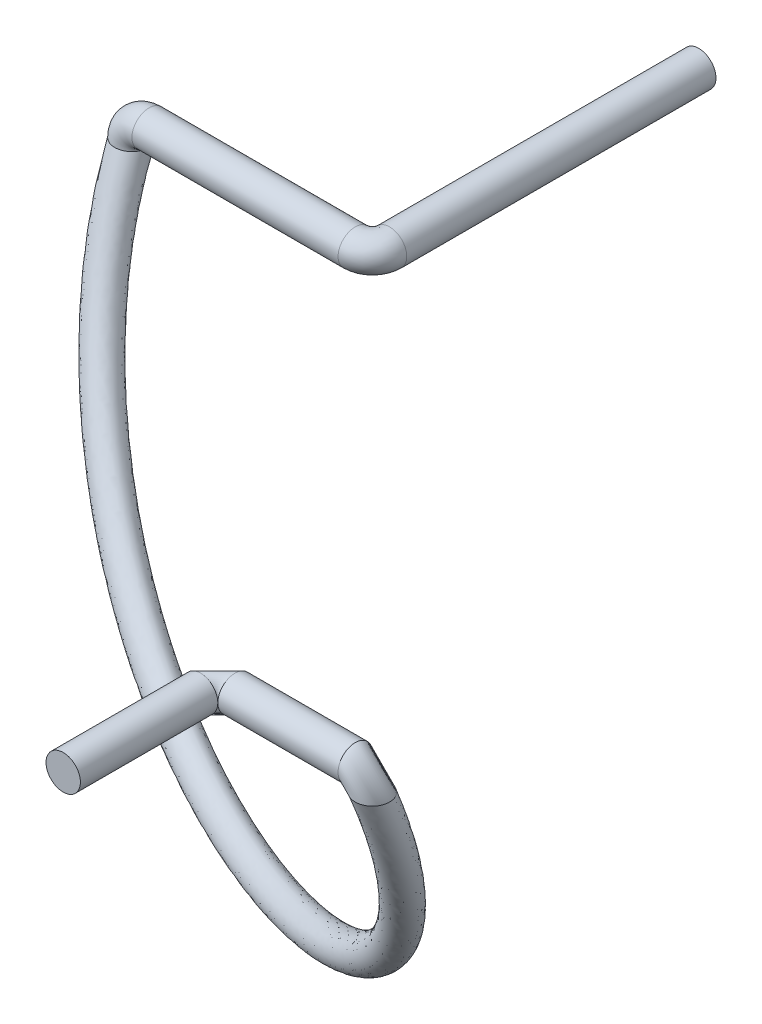
ISO-10303-21;
HEADER;
FILE_DESCRIPTION(('STEP AP214'),'2;1');
FILE_NAME('part.step','',(''),(''),'','','');
FILE_SCHEMA(('AUTOMOTIVE_DESIGN { 1 0 10303 214 1 1 1 1 }'));
ENDSEC;
DATA;
#1=APPLICATION_CONTEXT('core data for automotive mechanical design processes');
#2=APPLICATION_PROTOCOL_DEFINITION('international standard','automotive_design',2000,#1);
#3=PRODUCT_CONTEXT('',#1,'mechanical');
#4=PRODUCT('Part','Part','',(#3));
#5=PRODUCT_RELATED_PRODUCT_CATEGORY('part','',(#4));
#6=PRODUCT_DEFINITION_FORMATION('','',#4);
#7=PRODUCT_DEFINITION_CONTEXT('part definition',#1,'design');
#8=PRODUCT_DEFINITION('design','',#6,#7);
#9=PRODUCT_DEFINITION_SHAPE('','',#8);
#10=(LENGTH_UNIT() NAMED_UNIT(*) SI_UNIT(.MILLI.,.METRE.));
#11=(NAMED_UNIT(*) PLANE_ANGLE_UNIT() SI_UNIT($,.RADIAN.));
#12=(NAMED_UNIT(*) SI_UNIT($,.STERADIAN.) SOLID_ANGLE_UNIT());
#13=UNCERTAINTY_MEASURE_WITH_UNIT(LENGTH_MEASURE(1.E-05),#10,'distance_accuracy_value','');
#14=(GEOMETRIC_REPRESENTATION_CONTEXT(3) GLOBAL_UNCERTAINTY_ASSIGNED_CONTEXT((#13)) GLOBAL_UNIT_ASSIGNED_CONTEXT((#10,
#11,#12)) REPRESENTATION_CONTEXT('',''));
#15=CARTESIAN_POINT('',(0.,0.,0.));
#16=DIRECTION('',(0.,0.,1.));
#17=DIRECTION('',(1.,0.,0.));
#18=AXIS2_PLACEMENT_3D('',#15,#16,#17);
#19=CARTESIAN_POINT('',(-10.,0.,-12.5));
#20=CARTESIAN_POINT('',(-10.,-1.43778293994966,-11.9090909090909));
#21=CARTESIAN_POINT('',(-9.59492973614499,-2.81732556841423,-11.3181818181818));
#22=CARTESIAN_POINT('',(-9.18985947228998,-4.1968681968788,-10.7272727272727));
#23=CARTESIAN_POINT('',(-8.41253532831185,-5.40640817455592,-10.1363636363636));
#24=CARTESIAN_POINT('',(-7.63521118433372,-6.61594815223304,-9.54545454545454));
#25=CARTESIAN_POINT('',(-6.5486073394529,-7.55749574354254,-8.95454545454546));
#26=CARTESIAN_POINT('',(-5.46200349457209,-8.49904333485204,-8.36363636363636));
#27=CARTESIAN_POINT('',(-4.15415013001893,-9.09631995354516,-7.77272727272727));
#28=CARTESIAN_POINT('',(-2.84629676546577,-9.69359657223827,-7.18181818181818));
#29=CARTESIAN_POINT('',(-1.42314838273292,-9.89821441880932,-6.59090909090909));
#30=CARTESIAN_POINT('',(0.,-10.1028322653804,-6.));
#31=CARTESIAN_POINT('',(1.42314838273278,-9.89821441880934,-5.40909090909091));
#32=CARTESIAN_POINT('',(2.84629676546564,-9.69359657223831,-4.81818181818182));
#33=CARTESIAN_POINT('',(4.1541501300188,-9.09631995354521,-4.22727272727273));
#34=CARTESIAN_POINT('',(5.46200349457197,-8.49904333485211,-3.63636363636364));
#35=CARTESIAN_POINT('',(6.5486073394528,-7.55749574354263,-3.04545454545455));
#36=CARTESIAN_POINT('',(7.63521118433363,-6.61594815223315,-2.45454545454545));
#37=CARTESIAN_POINT('',(8.41253532831177,-5.40640817455604,-1.86363636363636));
#38=CARTESIAN_POINT('',(9.18985947228992,-4.19686819687892,-1.27272727272727));
#39=CARTESIAN_POINT('',(9.59492973614495,-2.81732556841436,-0.681818181818183));
#40=CARTESIAN_POINT('',(9.99999999999999,-1.4377829399498,-0.0909090909090911));
#41=CARTESIAN_POINT('',(10.,0.,0.499999999999999));
#42=CARTESIAN_POINT('',(-11.,0.,-12.5));
#43=CARTESIAN_POINT('',(-11.,-1.58156123394463,-11.9090909090909));
#44=CARTESIAN_POINT('',(-10.5544227097595,-3.09905812525565,-11.3181818181818));
#45=CARTESIAN_POINT('',(-10.108845419519,-4.61655501656668,-10.7272727272727));
#46=CARTESIAN_POINT('',(-9.25378886114304,-5.94704899201151,-10.1363636363636));
#47=CARTESIAN_POINT('',(-8.3987323027671,-7.27754296745634,-9.54545454545454));
#48=CARTESIAN_POINT('',(-7.2034680733982,-8.31324531789679,-8.95454545454546));
#49=CARTESIAN_POINT('',(-6.00820384402929,-9.34894766833724,-8.36363636363636));
#50=CARTESIAN_POINT('',(-4.56956514302082,-10.0059519488997,-7.77272727272727));
#51=CARTESIAN_POINT('',(-3.13092644201235,-10.6629562294621,-7.18181818181818));
#52=CARTESIAN_POINT('',(-1.56546322100621,-10.8880358606903,-6.59090909090909));
#53=CARTESIAN_POINT('',(0.,-11.1131154919184,-6.));
#54=CARTESIAN_POINT('',(1.56546322100606,-10.8880358606903,-5.40909090909091));
#55=CARTESIAN_POINT('',(3.1309264420122,-10.6629562294621,-4.81818181818182));
#56=CARTESIAN_POINT('',(4.56956514302068,-10.0059519488997,-4.22727272727273));
#57=CARTESIAN_POINT('',(6.00820384402916,-9.34894766833732,-3.63636363636364));
#58=CARTESIAN_POINT('',(7.20346807339808,-8.31324531789689,-3.04545454545455));
#59=CARTESIAN_POINT('',(8.39873230276699,-7.27754296745646,-2.45454545454545));
#60=CARTESIAN_POINT('',(9.25378886114295,-5.94704899201164,-1.86363636363636));
#61=CARTESIAN_POINT('',(10.1088454195189,-4.61655501656682,-1.27272727272727));
#62=CARTESIAN_POINT('',(10.5544227097595,-3.0990581252558,-0.681818181818183));
#63=CARTESIAN_POINT('',(11.,-1.58156123394478,-0.0909090909090911));
#64=CARTESIAN_POINT('',(11.,0.,0.499999999999999));
#65=CARTESIAN_POINT('',(-11.,0.,-13.5));
#66=CARTESIAN_POINT('',(-11.,-1.58156123394463,-12.9090909090909));
#67=CARTESIAN_POINT('',(-10.5544227097595,-3.09905812525565,-12.3181818181818));
#68=CARTESIAN_POINT('',(-10.108845419519,-4.61655501656668,-11.7272727272727));
#69=CARTESIAN_POINT('',(-9.25378886114304,-5.94704899201151,-11.1363636363636));
#70=CARTESIAN_POINT('',(-8.3987323027671,-7.27754296745634,-10.5454545454545));
#71=CARTESIAN_POINT('',(-7.2034680733982,-8.31324531789679,-9.95454545454546));
#72=CARTESIAN_POINT('',(-6.00820384402929,-9.34894766833724,-9.36363636363636));
#73=CARTESIAN_POINT('',(-4.56956514302082,-10.0059519488997,-8.77272727272727));
#74=CARTESIAN_POINT('',(-3.13092644201235,-10.6629562294621,-8.18181818181818));
#75=CARTESIAN_POINT('',(-1.56546322100621,-10.8880358606903,-7.59090909090909));
#76=CARTESIAN_POINT('',(0.,-11.1131154919184,-7.));
#77=CARTESIAN_POINT('',(1.56546322100606,-10.8880358606903,-6.40909090909091));
#78=CARTESIAN_POINT('',(3.1309264420122,-10.6629562294621,-5.81818181818182));
#79=CARTESIAN_POINT('',(4.56956514302068,-10.0059519488997,-5.22727272727273));
#80=CARTESIAN_POINT('',(6.00820384402916,-9.34894766833732,-4.63636363636364));
#81=CARTESIAN_POINT('',(7.20346807339808,-8.31324531789689,-4.04545454545455));
#82=CARTESIAN_POINT('',(8.39873230276699,-7.27754296745646,-3.45454545454546));
#83=CARTESIAN_POINT('',(9.25378886114295,-5.94704899201164,-2.86363636363637));
#84=CARTESIAN_POINT('',(10.1088454195189,-4.61655501656682,-2.27272727272727));
#85=CARTESIAN_POINT('',(10.5544227097595,-3.0990581252558,-1.68181818181818));
#86=CARTESIAN_POINT('',(11.,-1.58156123394478,-1.09090909090909));
#87=CARTESIAN_POINT('',(11.,0.,-0.500000000000002));
#88=CARTESIAN_POINT('',(-10.,0.,-13.5));
#89=CARTESIAN_POINT('',(-10.,-1.43778293994966,-12.9090909090909));
#90=CARTESIAN_POINT('',(-9.59492973614499,-2.81732556841423,-12.3181818181818));
#91=CARTESIAN_POINT('',(-9.18985947228998,-4.1968681968788,-11.7272727272727));
#92=CARTESIAN_POINT('',(-8.41253532831185,-5.40640817455592,-11.1363636363636));
#93=CARTESIAN_POINT('',(-7.63521118433372,-6.61594815223304,-10.5454545454545));
#94=CARTESIAN_POINT('',(-6.5486073394529,-7.55749574354254,-9.95454545454546));
#95=CARTESIAN_POINT('',(-5.46200349457209,-8.49904333485204,-9.36363636363636));
#96=CARTESIAN_POINT('',(-4.15415013001893,-9.09631995354516,-8.77272727272727));
#97=CARTESIAN_POINT('',(-2.84629676546577,-9.69359657223827,-8.18181818181818));
#98=CARTESIAN_POINT('',(-1.42314838273292,-9.89821441880932,-7.59090909090909));
#99=CARTESIAN_POINT('',(0.,-10.1028322653804,-7.));
#100=CARTESIAN_POINT('',(1.42314838273278,-9.89821441880934,-6.40909090909091));
#101=CARTESIAN_POINT('',(2.84629676546564,-9.69359657223831,-5.81818181818182));
#102=CARTESIAN_POINT('',(4.1541501300188,-9.09631995354521,-5.22727272727273));
#103=CARTESIAN_POINT('',(5.46200349457197,-8.49904333485211,-4.63636363636364));
#104=CARTESIAN_POINT('',(6.5486073394528,-7.55749574354263,-4.04545454545455));
#105=CARTESIAN_POINT('',(7.63521118433363,-6.61594815223315,-3.45454545454546));
#106=CARTESIAN_POINT('',(8.41253532831177,-5.40640817455604,-2.86363636363637));
#107=CARTESIAN_POINT('',(9.18985947228992,-4.19686819687892,-2.27272727272727));
#108=CARTESIAN_POINT('',(9.59492973614495,-2.81732556841436,-1.68181818181818));
#109=CARTESIAN_POINT('',(9.99999999999999,-1.4377829399498,-1.09090909090909));
#110=CARTESIAN_POINT('',(10.,0.,-0.500000000000002));
#111=CARTESIAN_POINT('',(-9.,0.,-13.5));
#112=CARTESIAN_POINT('',(-9.00000000000001,-1.2940046459547,-12.9090909090909));
#113=CARTESIAN_POINT('',(-8.63543676253049,-2.53559301157281,-12.3181818181818));
#114=CARTESIAN_POINT('',(-8.27087352506098,-3.77718137719092,-11.7272727272727));
#115=CARTESIAN_POINT('',(-7.57128179548066,-4.86576735710033,-11.1363636363636));
#116=CARTESIAN_POINT('',(-6.87169006590035,-5.95435333700974,-10.5454545454545));
#117=CARTESIAN_POINT('',(-5.89374660550761,-6.80174616918828,-9.95454545454546));
#118=CARTESIAN_POINT('',(-4.91580314511488,-7.64913900136683,-9.36363636363636));
#119=CARTESIAN_POINT('',(-3.73873511701703,-8.18668795819064,-8.77272727272727));
#120=CARTESIAN_POINT('',(-2.56166708891919,-8.72423691501444,-8.18181818181818));
#121=CARTESIAN_POINT('',(-1.28083354445963,-8.90839297692838,-7.59090909090909));
#122=CARTESIAN_POINT('',(0.,-9.09254903884232,-7.));
#123=CARTESIAN_POINT('',(1.2808335444595,-8.9083929769284,-6.40909090909091));
#124=CARTESIAN_POINT('',(2.56166708891907,-8.72423691501448,-5.81818181818182));
#125=CARTESIAN_POINT('',(3.73873511701692,-8.18668795819069,-5.22727272727273));
#126=CARTESIAN_POINT('',(4.91580314511477,-7.6491390013669,-4.63636363636364));
#127=CARTESIAN_POINT('',(5.89374660550752,-6.80174616918836,-4.04545454545455));
#128=CARTESIAN_POINT('',(6.87169006590026,-5.95435333700983,-3.45454545454546));
#129=CARTESIAN_POINT('',(7.5712817954806,-4.86576735710043,-2.86363636363637));
#130=CARTESIAN_POINT('',(8.27087352506093,-3.77718137719103,-2.27272727272727));
#131=CARTESIAN_POINT('',(8.63543676253046,-2.53559301157293,-1.68181818181818));
#132=CARTESIAN_POINT('',(8.99999999999999,-1.29400464595482,-1.09090909090909));
#133=CARTESIAN_POINT('',(9.,0.,-0.500000000000002));
#134=CARTESIAN_POINT('',(-9.,0.,-12.5));
#135=CARTESIAN_POINT('',(-9.00000000000001,-1.2940046459547,-11.9090909090909));
#136=CARTESIAN_POINT('',(-8.63543676253049,-2.53559301157281,-11.3181818181818));
#137=CARTESIAN_POINT('',(-8.27087352506098,-3.77718137719092,-10.7272727272727));
#138=CARTESIAN_POINT('',(-7.57128179548066,-4.86576735710033,-10.1363636363636));
#139=CARTESIAN_POINT('',(-6.87169006590035,-5.95435333700974,-9.54545454545454));
#140=CARTESIAN_POINT('',(-5.89374660550761,-6.80174616918828,-8.95454545454546));
#141=CARTESIAN_POINT('',(-4.91580314511488,-7.64913900136683,-8.36363636363636));
#142=CARTESIAN_POINT('',(-3.73873511701703,-8.18668795819064,-7.77272727272727));
#143=CARTESIAN_POINT('',(-2.56166708891919,-8.72423691501444,-7.18181818181818));
#144=CARTESIAN_POINT('',(-1.28083354445963,-8.90839297692838,-6.59090909090909));
#145=CARTESIAN_POINT('',(0.,-9.09254903884232,-6.));
#146=CARTESIAN_POINT('',(1.2808335444595,-8.9083929769284,-5.40909090909091));
#147=CARTESIAN_POINT('',(2.56166708891907,-8.72423691501448,-4.81818181818182));
#148=CARTESIAN_POINT('',(3.73873511701692,-8.18668795819069,-4.22727272727273));
#149=CARTESIAN_POINT('',(4.91580314511477,-7.6491390013669,-3.63636363636364));
#150=CARTESIAN_POINT('',(5.89374660550752,-6.80174616918836,-3.04545454545455));
#151=CARTESIAN_POINT('',(6.87169006590026,-5.95435333700983,-2.45454545454545));
#152=CARTESIAN_POINT('',(7.5712817954806,-4.86576735710043,-1.86363636363636));
#153=CARTESIAN_POINT('',(8.27087352506093,-3.77718137719103,-1.27272727272727));
#154=CARTESIAN_POINT('',(8.63543676253046,-2.53559301157293,-0.681818181818183));
#155=CARTESIAN_POINT('',(8.99999999999999,-1.29400464595482,-0.0909090909090911));
#156=CARTESIAN_POINT('',(9.,0.,0.499999999999999));
#157=CARTESIAN_POINT('',(-10.,0.,-12.5));
#158=CARTESIAN_POINT('',(-10.,-1.43778293994966,-11.9090909090909));
#159=CARTESIAN_POINT('',(-9.59492973614499,-2.81732556841423,-11.3181818181818));
#160=CARTESIAN_POINT('',(-9.18985947228998,-4.1968681968788,-10.7272727272727));
#161=CARTESIAN_POINT('',(-8.41253532831185,-5.40640817455592,-10.1363636363636));
#162=CARTESIAN_POINT('',(-7.63521118433372,-6.61594815223304,-9.54545454545454));
#163=CARTESIAN_POINT('',(-6.5486073394529,-7.55749574354254,-8.95454545454546));
#164=CARTESIAN_POINT('',(-5.46200349457209,-8.49904333485204,-8.36363636363636));
#165=CARTESIAN_POINT('',(-4.15415013001893,-9.09631995354516,-7.77272727272727));
#166=CARTESIAN_POINT('',(-2.84629676546577,-9.69359657223827,-7.18181818181818));
#167=CARTESIAN_POINT('',(-1.42314838273292,-9.89821441880932,-6.59090909090909));
#168=CARTESIAN_POINT('',(0.,-10.1028322653804,-6.));
#169=CARTESIAN_POINT('',(1.42314838273278,-9.89821441880934,-5.40909090909091));
#170=CARTESIAN_POINT('',(2.84629676546564,-9.69359657223831,-4.81818181818182));
#171=CARTESIAN_POINT('',(4.1541501300188,-9.09631995354521,-4.22727272727273));
#172=CARTESIAN_POINT('',(5.46200349457197,-8.49904333485211,-3.63636363636364));
#173=CARTESIAN_POINT('',(6.5486073394528,-7.55749574354263,-3.04545454545455));
#174=CARTESIAN_POINT('',(7.63521118433363,-6.61594815223315,-2.45454545454545));
#175=CARTESIAN_POINT('',(8.41253532831177,-5.40640817455604,-1.86363636363636));
#176=CARTESIAN_POINT('',(9.18985947228992,-4.19686819687892,-1.27272727272727));
#177=CARTESIAN_POINT('',(9.59492973614495,-2.81732556841436,-0.681818181818183));
#178=CARTESIAN_POINT('',(9.99999999999999,-1.4377829399498,-0.0909090909090911));
#179=CARTESIAN_POINT('',(10.,0.,0.499999999999999));
#180=(BOUNDED_SURFACE() B_SPLINE_SURFACE(3,2,((#19,#20,#21,#22,#23,#24,#25,#26,#27,#28,#29,#30,
#31,#32,#33,#34,#35,#36,#37,#38,#39,#40,#41),(#42,#43,#44,#45,#46,#47,#48,#49,#50,#51,#52,#53,
#54,#55,#56,#57,#58,#59,#60,#61,#62,#63,#64),(#65,#66,#67,#68,#69,#70,#71,#72,#73,#74,#75,#76,
#77,#78,#79,#80,#81,#82,#83,#84,#85,#86,#87),(#88,#89,#90,#91,#92,#93,#94,#95,#96,#97,#98,#99,
#100,#101,#102,#103,#104,#105,#106,#107,#108,#109,#110),(#111,#112,#113,#114,#115,#116,#117,
#118,#119,#120,#121,#122,#123,#124,#125,#126,#127,#128,#129,#130,#131,#132,#133),(#134,#135,
#136,#137,#138,#139,#140,#141,#142,#143,#144,#145,#146,#147,#148,#149,#150,#151,#152,#153,#154,
#155,#156),(#157,#158,#159,#160,#161,#162,#163,#164,#165,#166,#167,#168,#169,#170,#171,#172,
#173,#174,#175,#176,#177,#178,#179)),.UNSPECIFIED.,.T.,.F.,.F.) B_SPLINE_SURFACE_WITH_KNOTS((4,
3,4),(3,2,2,2,2,2,2,2,2,2,2,3),(0.,0.5,1.),(0.,0.0454545454545455,0.0909090909090909,
0.136363636363636,0.181818181818182,0.227272727272727,0.272727272727273,0.318181818181818,
0.363636363636364,0.409090909090909,0.454545454545455,0.5),
.UNSPECIFIED.) GEOMETRIC_REPRESENTATION_ITEM() RATIONAL_B_SPLINE_SURFACE(((1.,0.989821441880933,
1.,0.989821441880933,1.,0.989821441880933,1.,0.989821441880933,1.,0.989821441880933,1.,
0.989821441880933,1.,0.989821441880933,1.,0.989821441880933,1.,0.989821441880933,1.,
0.989821441880933,1.,0.989821441880933,1.),(0.333333333333333,0.329940480626978,
0.333333333333333,0.329940480626978,0.333333333333333,0.329940480626978,0.333333333333333,
0.329940480626978,0.333333333333333,0.329940480626978,0.333333333333333,0.329940480626978,
0.333333333333333,0.329940480626978,0.333333333333333,0.329940480626978,0.333333333333333,
0.329940480626978,0.333333333333333,0.329940480626978,0.333333333333333,0.329940480626978,
0.333333333333333),(0.333333333333333,0.329940480626978,0.333333333333333,0.329940480626978,
0.333333333333333,0.329940480626978,0.333333333333333,0.329940480626978,0.333333333333333,
0.329940480626978,0.333333333333333,0.329940480626978,0.333333333333333,0.329940480626978,
0.333333333333333,0.329940480626978,0.333333333333333,0.329940480626978,0.333333333333333,
0.329940480626978,0.333333333333333,0.329940480626978,0.333333333333333),(1.,0.989821441880933,
1.,0.989821441880933,1.,0.989821441880933,1.,0.989821441880933,1.,0.989821441880933,1.,
0.989821441880933,1.,0.989821441880933,1.,0.989821441880933,1.,0.989821441880933,1.,
0.989821441880933,1.,0.989821441880933,1.),(0.333333333333333,0.329940480626978,
0.333333333333333,0.329940480626978,0.333333333333333,0.329940480626978,0.333333333333333,
0.329940480626978,0.333333333333333,0.329940480626978,0.333333333333333,0.329940480626978,
0.333333333333333,0.329940480626978,0.333333333333333,0.329940480626978,0.333333333333333,
0.329940480626978,0.333333333333333,0.329940480626978,0.333333333333333,0.329940480626978,
0.333333333333333),(0.333333333333333,0.329940480626978,0.333333333333333,0.329940480626978,
0.333333333333333,0.329940480626978,0.333333333333333,0.329940480626978,0.333333333333333,
0.329940480626978,0.333333333333333,0.329940480626978,0.333333333333333,0.329940480626978,
0.333333333333333,0.329940480626978,0.333333333333333,0.329940480626978,0.333333333333333,
0.329940480626978,0.333333333333333,0.329940480626978,0.333333333333333),(1.,0.989821441880933,
1.,0.989821441880933,1.,0.989821441880933,1.,0.989821441880933,1.,0.989821441880933,1.,
0.989821441880933,1.,0.989821441880933,1.,0.989821441880933,1.,0.989821441880933,1.,
0.989821441880933,1.,0.989821441880933,1.))) REPRESENTATION_ITEM('') SURFACE());
#181=CARTESIAN_POINT('',(-10.,0.,-13.));
#182=DIRECTION('',(0.,-1.,0.));
#183=DIRECTION('',(1.,0.,0.));
#184=AXIS2_PLACEMENT_3D('',#181,#182,#183);
#185=CIRCLE('',#184,0.5);
#186=CARTESIAN_POINT('',(-9.5,0.,-13.));
#187=VERTEX_POINT('',#186);
#188=EDGE_CURVE('E45',#187,#187,#185,.T.);
#189=CARTESIAN_POINT('',(10.,0.,0.));
#190=DIRECTION('',(0.,-1.,0.));
#191=DIRECTION('',(1.,0.,0.));
#192=AXIS2_PLACEMENT_3D('',#189,#190,#191);
#193=CIRCLE('',#192,0.5);
#194=CARTESIAN_POINT('',(9.5,0.,0.));
#195=VERTEX_POINT('',#194);
#196=EDGE_CURVE('E12',#195,#195,#193,.T.);
#197=ORIENTED_EDGE('',*,*,#188,.T.);
#198=EDGE_LOOP('',(#197));
#199=FACE_BOUND('',#198,.T.);
#200=ORIENTED_EDGE('',*,*,#196,.T.);
#201=EDGE_LOOP('',(#200));
#202=FACE_BOUND('',#201,.T.);
#203=ADVANCED_FACE('F40',(#199,#202),#180,.T.);
#204=CARTESIAN_POINT('',(9.5,0.,0.));
#205=DIRECTION('',(0.,0.,1.));
#206=DIRECTION('',(1.,0.,0.));
#207=AXIS2_PLACEMENT_3D('',#204,#205,#206);
#208=DEGENERATE_TOROIDAL_SURFACE('',#207,0.5,0.5,.T.);
#209=CARTESIAN_POINT('',(9.50000000000007,0.5,0.));
#210=DIRECTION('',(1.,0.,0.));
#211=DIRECTION('',(0.,1.,0.));
#212=AXIS2_PLACEMENT_3D('',#209,#210,#211);
#213=CIRCLE('',#212,0.5);
#214=EDGE_CURVE('E89',#195,#195,#213,.T.);
#215=ORIENTED_EDGE('',*,*,#214,.T.);
#216=ORIENTED_EDGE('',*,*,#196,.F.);
#217=EDGE_LOOP('',(#215,#216));
#218=FACE_BOUND('',#217,.T.);
#219=ADVANCED_FACE('F120',(#218),#208,.T.);
#220=CARTESIAN_POINT('',(9.50000000000007,0.5,0.));
#221=DIRECTION('',(-1.,0.,0.));
#222=DIRECTION('',(0.,-1.,0.));
#223=AXIS2_PLACEMENT_3D('',#220,#221,#222);
#224=CYLINDRICAL_SURFACE('',#223,0.5);
#225=CARTESIAN_POINT('',(6.00000000000007,0.5,0.));
#226=DIRECTION('',(1.,0.,0.));
#227=DIRECTION('',(0.,1.,0.));
#228=AXIS2_PLACEMENT_3D('',#225,#226,#227);
#229=CIRCLE('',#228,0.5);
#230=CARTESIAN_POINT('',(6.00000000000007,0.499999999999998,0.5));
#231=VERTEX_POINT('',#230);
#232=EDGE_CURVE('E91',#231,#231,#229,.T.);
#233=ORIENTED_EDGE('',*,*,#232,.T.);
#234=EDGE_LOOP('',(#233));
#235=FACE_BOUND('',#234,.T.);
#236=ORIENTED_EDGE('',*,*,#214,.F.);
#237=EDGE_LOOP('',(#236));
#238=FACE_BOUND('',#237,.T.);
#239=ADVANCED_FACE('F117',(#235,#238),#224,.T.);
#240=CARTESIAN_POINT('',(5.50000000000007,0.499999999999998,4.49999999999993));
#241=DIRECTION('',(-1.42247325030098E-13,0.,1.));
#242=DIRECTION('',(0.,-1.,0.));
#243=AXIS2_PLACEMENT_3D('',#240,#241,#242);
#244=PLANE('',#243);
#245=CARTESIAN_POINT('',(5.50000000000007,0.499999999999998,4.49999999999993));
#246=DIRECTION('',(-1.42247325030098E-13,0.,1.));
#247=DIRECTION('',(0.,-1.,0.));
#248=AXIS2_PLACEMENT_3D('',#245,#246,#247);
#249=CIRCLE('',#248,0.499999999999999);
#250=CARTESIAN_POINT('',(5.50000000000007,0.,4.49999999999993));
#251=VERTEX_POINT('',#250);
#252=EDGE_CURVE('E58',#251,#251,#249,.T.);
#253=ORIENTED_EDGE('',*,*,#252,.T.);
#254=EDGE_LOOP('',(#253));
#255=FACE_BOUND('',#254,.T.);
#256=ADVANCED_FACE('F103',(#255),#244,.T.);
#257=CARTESIAN_POINT('',(6.00000000000007,0.499999999999998,0.5));
#258=DIRECTION('',(0.,1.,0.));
#259=DIRECTION('',(0.,0.,1.));
#260=AXIS2_PLACEMENT_3D('',#257,#258,#259);
#261=TOROIDAL_SURFACE('',#260,0.5,0.499999999999999);
#262=CARTESIAN_POINT('',(5.50000000000007,0.499999999999998,0.499999999999933));
#263=DIRECTION('',(-1.42464165464595E-13,0.,1.));
#264=DIRECTION('',(0.,-1.,0.));
#265=AXIS2_PLACEMENT_3D('',#262,#263,#264);
#266=CIRCLE('',#265,0.499999999999999);
#267=EDGE_CURVE('E78',#231,#231,#266,.T.);
#268=ORIENTED_EDGE('',*,*,#267,.F.);
#269=ORIENTED_EDGE('',*,*,#232,.F.);
#270=EDGE_LOOP('',(#268,#269));
#271=FACE_BOUND('',#270,.T.);
#272=ADVANCED_FACE('F116',(#271),#261,.T.);
#273=CARTESIAN_POINT('',(5.50000000000007,0.499999999999998,0.499999999999933));
#274=DIRECTION('',(0.,0.,1.));
#275=DIRECTION('',(1.,0.,0.));
#276=AXIS2_PLACEMENT_3D('',#273,#274,#275);
#277=CYLINDRICAL_SURFACE('',#276,0.499999999999999);
#278=ORIENTED_EDGE('',*,*,#252,.F.);
#279=EDGE_LOOP('',(#278));
#280=FACE_BOUND('',#279,.T.);
#281=ORIENTED_EDGE('',*,*,#267,.T.);
#282=EDGE_LOOP('',(#281));
#283=FACE_BOUND('',#282,.T.);
#284=ADVANCED_FACE('F111',(#280,#283),#277,.T.);
#285=CARTESIAN_POINT('',(-10.,0.,-13.));
#286=DIRECTION('',(0.,-1.,0.));
#287=DIRECTION('',(-1.,0.,0.));
#288=AXIS2_PLACEMENT_3D('',#285,#286,#287);
#289=CIRCLE('',#288,0.500000000000001);
#290=TRIMMED_CURVE('',#289,(PARAMETER_VALUE(-3.14159261144294)),
(PARAMETER_VALUE(3.14159261144294)),.T.,.PARAMETER.);
#291=CARTESIAN_POINT('',(-9.5,0.,-13.));
#292=DIRECTION('',(0.,0.,-1.));
#293=AXIS1_PLACEMENT('',#291,#292);
#294=SURFACE_OF_REVOLUTION('',#290,#293);
#295=CARTESIAN_POINT('',(-9.49999999999993,0.5,-13.));
#296=DIRECTION('',(1.,0.,0.));
#297=DIRECTION('',(0.,1.,0.));
#298=AXIS2_PLACEMENT_3D('',#295,#296,#297);
#299=CIRCLE('',#298,0.500000000000001);
#300=EDGE_CURVE('E79',#187,#187,#299,.T.);
#301=ORIENTED_EDGE('',*,*,#300,.F.);
#302=ORIENTED_EDGE('',*,*,#188,.F.);
#303=EDGE_LOOP('',(#301,#302));
#304=FACE_BOUND('',#303,.T.);
#305=ADVANCED_FACE('F99',(#304),#294,.T.);
#306=CARTESIAN_POINT('',(-9.49999999999993,0.5,-13.));
#307=DIRECTION('',(1.,0.,0.));
#308=DIRECTION('',(0.,1.,0.));
#309=AXIS2_PLACEMENT_3D('',#306,#307,#308);
#310=CYLINDRICAL_SURFACE('',#309,0.500000000000001);
#311=CARTESIAN_POINT('',(-3.49999999999993,0.5,-13.));
#312=DIRECTION('',(1.,0.,0.));
#313=DIRECTION('',(0.,1.,0.));
#314=AXIS2_PLACEMENT_3D('',#311,#312,#313);
#315=CIRCLE('',#314,0.500000000000001);
#316=CARTESIAN_POINT('',(-3.49999999999993,0.499999999999979,-13.5));
#317=VERTEX_POINT('',#316);
#318=EDGE_CURVE('E72',#317,#317,#315,.T.);
#319=ORIENTED_EDGE('',*,*,#318,.F.);
#320=EDGE_LOOP('',(#319));
#321=FACE_BOUND('',#320,.T.);
#322=ORIENTED_EDGE('',*,*,#300,.T.);
#323=EDGE_LOOP('',(#322));
#324=FACE_BOUND('',#323,.T.);
#325=ADVANCED_FACE('F73',(#321,#324),#310,.T.);
#326=CARTESIAN_POINT('',(-2.99999999999993,0.499999999999979,-22.5));
#327=DIRECTION('',(0.,0.,-1.));
#328=DIRECTION('',(0.,1.,0.));
#329=AXIS2_PLACEMENT_3D('',#326,#327,#328);
#330=PLANE('',#329);
#331=CARTESIAN_POINT('',(-2.99999999999993,0.499999999999979,-22.5));
#332=DIRECTION('',(0.,0.,-1.));
#333=DIRECTION('',(0.,1.,0.));
#334=AXIS2_PLACEMENT_3D('',#331,#332,#333);
#335=CIRCLE('',#334,0.500000000000001);
#336=CARTESIAN_POINT('',(-2.99999999999993,0.99999999999998,-22.5));
#337=VERTEX_POINT('',#336);
#338=EDGE_CURVE('E84',#337,#337,#335,.T.);
#339=ORIENTED_EDGE('',*,*,#338,.T.);
#340=EDGE_LOOP('',(#339));
#341=FACE_BOUND('',#340,.T.);
#342=ADVANCED_FACE('F101',(#341),#330,.T.);
#343=CARTESIAN_POINT('',(-3.49999999999993,0.499999999999979,-13.));
#344=DIRECTION('',(-1.,0.,0.));
#345=DIRECTION('',(0.,0.,1.));
#346=AXIS2_PLACEMENT_3D('',#343,#344,#345);
#347=CIRCLE('',#346,0.500000000000001);
#348=TRIMMED_CURVE('',#347,(PARAMETER_VALUE(-3.14159261708955)),
(PARAMETER_VALUE(3.14159261708955)),.T.,.PARAMETER.);
#349=CARTESIAN_POINT('',(-3.49999999999993,0.499999999999979,-13.5));
#350=DIRECTION('',(0.,1.,0.));
#351=AXIS1_PLACEMENT('',#349,#350);
#352=SURFACE_OF_REVOLUTION('',#348,#351);
#353=CARTESIAN_POINT('',(-2.99999999999993,0.499999999999979,-13.5));
#354=DIRECTION('',(0.,0.,-1.));
#355=DIRECTION('',(0.,1.,0.));
#356=AXIS2_PLACEMENT_3D('',#353,#354,#355);
#357=CIRCLE('',#356,0.500000000000001);
#358=EDGE_CURVE('E183',#317,#317,#357,.T.);
#359=ORIENTED_EDGE('',*,*,#358,.F.);
#360=ORIENTED_EDGE('',*,*,#318,.T.);
#361=EDGE_LOOP('',(#359,#360));
#362=FACE_BOUND('',#361,.T.);
#363=ADVANCED_FACE('F108',(#362),#352,.T.);
#364=CARTESIAN_POINT('',(-2.99999999999993,0.499999999999979,-13.5));
#365=DIRECTION('',(0.,0.,-1.));
#366=DIRECTION('',(-1.,0.,0.));
#367=AXIS2_PLACEMENT_3D('',#364,#365,#366);
#368=CYLINDRICAL_SURFACE('',#367,0.500000000000001);
#369=ORIENTED_EDGE('',*,*,#338,.F.);
#370=EDGE_LOOP('',(#369));
#371=FACE_BOUND('',#370,.T.);
#372=ORIENTED_EDGE('',*,*,#358,.T.);
#373=EDGE_LOOP('',(#372));
#374=FACE_BOUND('',#373,.T.);
#375=ADVANCED_FACE('F113',(#371,#374),#368,.T.);
#376=CLOSED_SHELL('',(#203,#219,#239,#256,#272,#284,#305,#325,#342,#363,#375));
#377=MANIFOLD_SOLID_BREP('B2',#376);
#378=ADVANCED_BREP_SHAPE_REPRESENTATION('',(#18,#377),#14);
#379=SHAPE_DEFINITION_REPRESENTATION(#9,#378);
ENDSEC;
END-ISO-10303-21;
